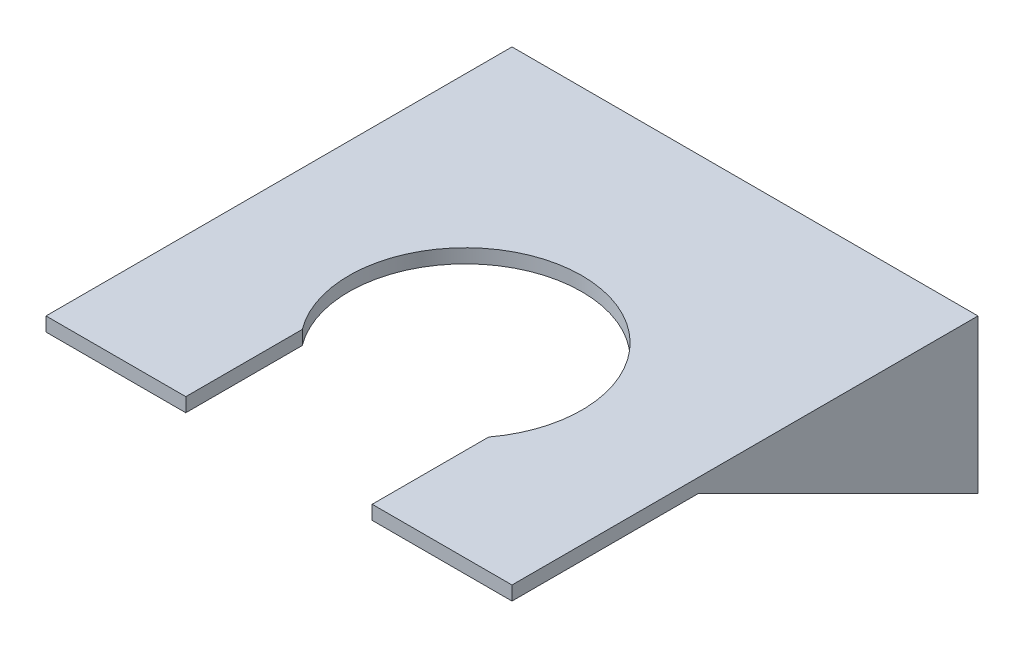
ISO-10303-21;
HEADER;
FILE_DESCRIPTION(('STEP AP214'),'2;1');
FILE_NAME('part.step','',(''),(''),'','','');
FILE_SCHEMA(('AUTOMOTIVE_DESIGN { 1 0 10303 214 1 1 1 1 }'));
ENDSEC;
DATA;
#1=APPLICATION_CONTEXT('core data for automotive mechanical design processes');
#2=APPLICATION_PROTOCOL_DEFINITION('international standard','automotive_design',2000,#1);
#3=PRODUCT_CONTEXT('',#1,'mechanical');
#4=PRODUCT('Part','Part','',(#3));
#5=PRODUCT_RELATED_PRODUCT_CATEGORY('part','',(#4));
#6=PRODUCT_DEFINITION_FORMATION('','',#4);
#7=PRODUCT_DEFINITION_CONTEXT('part definition',#1,'design');
#8=PRODUCT_DEFINITION('design','',#6,#7);
#9=PRODUCT_DEFINITION_SHAPE('','',#8);
#10=(LENGTH_UNIT() NAMED_UNIT(*) SI_UNIT(.MILLI.,.METRE.));
#11=(NAMED_UNIT(*) PLANE_ANGLE_UNIT() SI_UNIT($,.RADIAN.));
#12=(NAMED_UNIT(*) SI_UNIT($,.STERADIAN.) SOLID_ANGLE_UNIT());
#13=UNCERTAINTY_MEASURE_WITH_UNIT(LENGTH_MEASURE(1.E-05),#10,'distance_accuracy_value','');
#14=(GEOMETRIC_REPRESENTATION_CONTEXT(3) GLOBAL_UNCERTAINTY_ASSIGNED_CONTEXT((#13)) GLOBAL_UNIT_ASSIGNED_CONTEXT((#10,
#11,#12)) REPRESENTATION_CONTEXT('',''));
#15=CARTESIAN_POINT('',(0.,0.,0.));
#16=DIRECTION('',(0.,0.,1.));
#17=DIRECTION('',(1.,0.,0.));
#18=AXIS2_PLACEMENT_3D('',#15,#16,#17);
#19=CARTESIAN_POINT('',(-25.,-2.56176848089127,50.));
#20=DIRECTION('',(0.,1.,0.));
#21=DIRECTION('',(-1.,0.,0.));
#22=AXIS2_PLACEMENT_3D('',#19,#20,#21);
#23=PLANE('',#22);
#24=DIRECTION('',(1.,0.,0.));
#25=VECTOR('',#24,1.);
#26=CARTESIAN_POINT('',(23.5,-2.56176848089129,30.));
#27=LINE('',#26,#25);
#28=CARTESIAN_POINT('',(23.5,-2.56176848089126,30.));
#29=VERTEX_POINT('',#28);
#30=CARTESIAN_POINT('',(25.,-2.56176848089126,30.));
#31=VERTEX_POINT('',#30);
#32=EDGE_CURVE('E53',#29,#31,#27,.T.);
#33=ORIENTED_EDGE('',*,*,#32,.T.);
#34=DIRECTION('',(0.,0.,-1.));
#35=VECTOR('',#34,1.);
#36=CARTESIAN_POINT('',(25.,-2.56176848089126,50.));
#37=LINE('',#36,#35);
#38=CARTESIAN_POINT('',(25.,-2.56176848089126,50.));
#39=VERTEX_POINT('',#38);
#40=EDGE_CURVE('E41',#39,#31,#37,.T.);
#41=ORIENTED_EDGE('',*,*,#40,.F.);
#42=DIRECTION('',(1.,0.,0.));
#43=VECTOR('',#42,1.);
#44=CARTESIAN_POINT('',(-25.,-2.56176848089127,50.));
#45=LINE('',#44,#43);
#46=CARTESIAN_POINT('',(10.,-2.56176848089127,50.));
#47=VERTEX_POINT('',#46);
#48=EDGE_CURVE('E190',#47,#39,#45,.T.);
#49=ORIENTED_EDGE('',*,*,#48,.F.);
#50=DIRECTION('',(0.,0.,1.));
#51=VECTOR('',#50,1.);
#52=CARTESIAN_POINT('',(10.,-2.56176848089126,37.5));
#53=LINE('',#52,#51);
#54=CARTESIAN_POINT('',(10.,-2.56176848089126,37.5));
#55=VERTEX_POINT('',#54);
#56=EDGE_CURVE('E164',#55,#47,#53,.T.);
#57=ORIENTED_EDGE('',*,*,#56,.F.);
#58=CARTESIAN_POINT('',(0.,-2.56176848089126,30.));
#59=DIRECTION('',(0.,1.,0.));
#60=DIRECTION('',(-1.,0.,0.));
#61=AXIS2_PLACEMENT_3D('',#58,#59,#60);
#62=CIRCLE('',#61,12.5);
#63=CARTESIAN_POINT('',(-10.,-2.56176848089127,37.5));
#64=VERTEX_POINT('',#63);
#65=EDGE_CURVE('E166',#64,#55,#62,.F.);
#66=ORIENTED_EDGE('',*,*,#65,.F.);
#67=DIRECTION('',(0.,0.,-1.));
#68=VECTOR('',#67,1.);
#69=CARTESIAN_POINT('',(-10.,-2.56176848089127,37.5));
#70=LINE('',#69,#68);
#71=CARTESIAN_POINT('',(-10.,-2.56176848089127,50.));
#72=VERTEX_POINT('',#71);
#73=EDGE_CURVE('E169',#72,#64,#70,.T.);
#74=ORIENTED_EDGE('',*,*,#73,.F.);
#75=CARTESIAN_POINT('',(-25.,-2.56176848089127,50.));
#76=VERTEX_POINT('',#75);
#77=EDGE_CURVE('E192',#76,#72,#45,.T.);
#78=ORIENTED_EDGE('',*,*,#77,.F.);
#79=DIRECTION('',(0.,0.,-1.));
#80=VECTOR('',#79,1.);
#81=CARTESIAN_POINT('',(-25.,-2.56176848089127,50.));
#82=LINE('',#81,#80);
#83=CARTESIAN_POINT('',(-25.,-2.56176848089129,30.));
#84=VERTEX_POINT('',#83);
#85=EDGE_CURVE('E11',#76,#84,#82,.T.);
#86=ORIENTED_EDGE('',*,*,#85,.T.);
#87=DIRECTION('',(-1.,0.,0.));
#88=VECTOR('',#87,1.);
#89=CARTESIAN_POINT('',(-23.5,-2.56176848089129,30.));
#90=LINE('',#89,#88);
#91=CARTESIAN_POINT('',(-23.5,-2.56176848089129,30.));
#92=VERTEX_POINT('',#91);
#93=EDGE_CURVE('E159',#92,#84,#90,.T.);
#94=ORIENTED_EDGE('',*,*,#93,.F.);
#95=DIRECTION('',(0.,0.,-1.));
#96=VECTOR('',#95,1.);
#97=CARTESIAN_POINT('',(-23.5,-2.56176848089129,30.));
#98=LINE('',#97,#96);
#99=CARTESIAN_POINT('',(-23.5,-2.56176848089127,0.));
#100=VERTEX_POINT('',#99);
#101=EDGE_CURVE('E147',#92,#100,#98,.T.);
#102=ORIENTED_EDGE('',*,*,#101,.T.);
#103=DIRECTION('',(1.,0.,0.));
#104=VECTOR('',#103,1.);
#105=CARTESIAN_POINT('',(-25.,-2.56176848089127,0.));
#106=LINE('',#105,#104);
#107=CARTESIAN_POINT('',(23.5,-2.56176848089126,0.));
#108=VERTEX_POINT('',#107);
#109=EDGE_CURVE('E203',#100,#108,#106,.T.);
#110=ORIENTED_EDGE('',*,*,#109,.T.);
#111=DIRECTION('',(0.,0.,-1.));
#112=VECTOR('',#111,1.);
#113=CARTESIAN_POINT('',(23.5,-2.56176848089129,30.));
#114=LINE('',#113,#112);
#115=EDGE_CURVE('E48',#29,#108,#114,.T.);
#116=ORIENTED_EDGE('',*,*,#115,.F.);
#117=EDGE_LOOP('',(#33,#41,#49,#57,#66,#74,#78,#86,#94,#102,#110,#116));
#118=FACE_BOUND('',#117,.T.);
#119=ADVANCED_FACE('F33',(#118),#23,.F.);
#120=CARTESIAN_POINT('',(0.,0.,50.));
#121=DIRECTION('',(0.,0.,1.));
#122=DIRECTION('',(1.,0.,0.));
#123=AXIS2_PLACEMENT_3D('',#120,#121,#122);
#124=PLANE('',#123);
#125=DIRECTION('',(0.,1.,0.));
#126=VECTOR('',#125,1.);
#127=CARTESIAN_POINT('',(10.,-43.5648171480331,50.));
#128=LINE('',#127,#126);
#129=CARTESIAN_POINT('',(10.,-1.06176848089127,50.));
#130=VERTEX_POINT('',#129);
#131=EDGE_CURVE('E179',#47,#130,#128,.T.);
#132=ORIENTED_EDGE('',*,*,#131,.F.);
#133=ORIENTED_EDGE('',*,*,#48,.T.);
#134=DIRECTION('',(0.,1.,0.));
#135=VECTOR('',#134,1.);
#136=CARTESIAN_POINT('',(25.,-1.06176848089126,50.));
#137=LINE('',#136,#135);
#138=CARTESIAN_POINT('',(25.,-1.06176848089126,50.));
#139=VERTEX_POINT('',#138);
#140=EDGE_CURVE('E195',#39,#139,#137,.T.);
#141=ORIENTED_EDGE('',*,*,#140,.T.);
#142=DIRECTION('',(-1.,0.,0.));
#143=VECTOR('',#142,1.);
#144=CARTESIAN_POINT('',(-25.,-1.06176848089127,50.));
#145=LINE('',#144,#143);
#146=EDGE_CURVE('E198',#139,#130,#145,.T.);
#147=ORIENTED_EDGE('',*,*,#146,.T.);
#148=EDGE_LOOP('',(#132,#133,#141,#147));
#149=FACE_BOUND('',#148,.T.);
#150=ADVANCED_FACE('F220',(#149),#124,.T.);
#151=CARTESIAN_POINT('',(-25.,-1.06176848089127,50.));
#152=DIRECTION('',(1.,0.,0.));
#153=DIRECTION('',(0.,0.,-1.));
#154=AXIS2_PLACEMENT_3D('',#151,#152,#153);
#155=PLANE('',#154);
#156=DIRECTION('',(0.,-1.,0.));
#157=VECTOR('',#156,1.);
#158=CARTESIAN_POINT('',(-25.,-1.06176848089127,0.));
#159=LINE('',#158,#157);
#160=CARTESIAN_POINT('',(-25.,-1.06176848089127,0.));
#161=VERTEX_POINT('',#160);
#162=CARTESIAN_POINT('',(-25.,-17.5617684808913,0.));
#163=VERTEX_POINT('',#162);
#164=EDGE_CURVE('E186',#161,#163,#159,.T.);
#165=ORIENTED_EDGE('',*,*,#164,.T.);
#166=DIRECTION('',(0.,0.447213595499958,0.894427190999916));
#167=VECTOR('',#166,1.);
#168=CARTESIAN_POINT('',(-25.,-17.5617684808913,0.));
#169=LINE('',#168,#167);
#170=EDGE_CURVE('E138',#163,#84,#169,.T.);
#171=ORIENTED_EDGE('',*,*,#170,.T.);
#172=ORIENTED_EDGE('',*,*,#85,.F.);
#173=DIRECTION('',(0.,-1.,0.));
#174=VECTOR('',#173,1.);
#175=CARTESIAN_POINT('',(-25.,-1.06176848089127,50.));
#176=LINE('',#175,#174);
#177=CARTESIAN_POINT('',(-25.,-1.06176848089127,50.));
#178=VERTEX_POINT('',#177);
#179=EDGE_CURVE('E187',#178,#76,#176,.T.);
#180=ORIENTED_EDGE('',*,*,#179,.F.);
#181=DIRECTION('',(0.,0.,-1.));
#182=VECTOR('',#181,1.);
#183=CARTESIAN_POINT('',(-25.,-1.06176848089127,50.));
#184=LINE('',#183,#182);
#185=EDGE_CURVE('E201',#178,#161,#184,.T.);
#186=ORIENTED_EDGE('',*,*,#185,.T.);
#187=EDGE_LOOP('',(#165,#171,#172,#180,#186));
#188=FACE_BOUND('',#187,.T.);
#189=ADVANCED_FACE('F35',(#188),#155,.F.);
#190=CARTESIAN_POINT('',(25.,-1.06176848089126,50.));
#191=DIRECTION('',(-1.,0.,0.));
#192=DIRECTION('',(0.,0.,1.));
#193=AXIS2_PLACEMENT_3D('',#190,#191,#192);
#194=PLANE('',#193);
#195=DIRECTION('',(0.,1.,0.));
#196=VECTOR('',#195,1.);
#197=CARTESIAN_POINT('',(25.,-1.06176848089126,0.));
#198=LINE('',#197,#196);
#199=CARTESIAN_POINT('',(25.,-17.5617684808913,0.));
#200=VERTEX_POINT('',#199);
#201=CARTESIAN_POINT('',(25.,-1.06176848089126,0.));
#202=VERTEX_POINT('',#201);
#203=EDGE_CURVE('E134',#200,#202,#198,.T.);
#204=ORIENTED_EDGE('',*,*,#203,.T.);
#205=DIRECTION('',(0.,0.,-1.));
#206=VECTOR('',#205,1.);
#207=CARTESIAN_POINT('',(25.,-1.06176848089126,50.));
#208=LINE('',#207,#206);
#209=EDGE_CURVE('E209',#139,#202,#208,.T.);
#210=ORIENTED_EDGE('',*,*,#209,.F.);
#211=ORIENTED_EDGE('',*,*,#140,.F.);
#212=ORIENTED_EDGE('',*,*,#40,.T.);
#213=DIRECTION('',(0.,0.447213595499958,0.894427190999916));
#214=VECTOR('',#213,1.);
#215=CARTESIAN_POINT('',(25.,-17.5617684808913,0.));
#216=LINE('',#215,#214);
#217=EDGE_CURVE('E142',#200,#31,#216,.T.);
#218=ORIENTED_EDGE('',*,*,#217,.F.);
#219=EDGE_LOOP('',(#204,#210,#211,#212,#218));
#220=FACE_BOUND('',#219,.T.);
#221=ADVANCED_FACE('F213',(#220),#194,.F.);
#222=CARTESIAN_POINT('',(-25.,-1.06176848089127,50.));
#223=DIRECTION('',(0.,-1.,0.));
#224=DIRECTION('',(1.,0.,0.));
#225=AXIS2_PLACEMENT_3D('',#222,#223,#224);
#226=PLANE('',#225);
#227=CARTESIAN_POINT('',(0.,-1.06176848089127,30.));
#228=DIRECTION('',(0.,1.,0.));
#229=DIRECTION('',(0.,0.,1.));
#230=AXIS2_PLACEMENT_3D('',#227,#228,#229);
#231=CIRCLE('',#230,12.5);
#232=CARTESIAN_POINT('',(10.,-1.06176848089127,37.5));
#233=VERTEX_POINT('',#232);
#234=CARTESIAN_POINT('',(-10.,-1.06176848089127,37.5));
#235=VERTEX_POINT('',#234);
#236=EDGE_CURVE('E161',#233,#235,#231,.T.);
#237=ORIENTED_EDGE('',*,*,#236,.F.);
#238=DIRECTION('',(0.,0.,-1.));
#239=VECTOR('',#238,1.);
#240=CARTESIAN_POINT('',(10.,-1.06176848089127,37.5));
#241=LINE('',#240,#239);
#242=EDGE_CURVE('E174',#130,#233,#241,.T.);
#243=ORIENTED_EDGE('',*,*,#242,.F.);
#244=ORIENTED_EDGE('',*,*,#146,.F.);
#245=ORIENTED_EDGE('',*,*,#209,.T.);
#246=DIRECTION('',(-1.,0.,0.));
#247=VECTOR('',#246,1.);
#248=CARTESIAN_POINT('',(-25.,-1.06176848089127,0.));
#249=LINE('',#248,#247);
#250=EDGE_CURVE('E191',#202,#161,#249,.T.);
#251=ORIENTED_EDGE('',*,*,#250,.T.);
#252=ORIENTED_EDGE('',*,*,#185,.F.);
#253=CARTESIAN_POINT('',(-10.,-1.06176848089127,50.));
#254=VERTEX_POINT('',#253);
#255=EDGE_CURVE('E197',#254,#178,#145,.T.);
#256=ORIENTED_EDGE('',*,*,#255,.F.);
#257=DIRECTION('',(0.,0.,1.));
#258=VECTOR('',#257,1.);
#259=CARTESIAN_POINT('',(-10.,-1.06176848089127,37.5));
#260=LINE('',#259,#258);
#261=EDGE_CURVE('E172',#235,#254,#260,.T.);
#262=ORIENTED_EDGE('',*,*,#261,.F.);
#263=EDGE_LOOP('',(#237,#243,#244,#245,#251,#252,#256,#262));
#264=FACE_BOUND('',#263,.T.);
#265=ADVANCED_FACE('F228',(#264),#226,.F.);
#266=DIRECTION('',(0.,1.,0.));
#267=VECTOR('',#266,1.);
#268=CARTESIAN_POINT('',(-10.,-43.5648171480331,50.));
#269=LINE('',#268,#267);
#270=EDGE_CURVE('E181',#72,#254,#269,.T.);
#271=ORIENTED_EDGE('',*,*,#270,.T.);
#272=ORIENTED_EDGE('',*,*,#255,.T.);
#273=ORIENTED_EDGE('',*,*,#179,.T.);
#274=ORIENTED_EDGE('',*,*,#77,.T.);
#275=EDGE_LOOP('',(#271,#272,#273,#274));
#276=FACE_BOUND('',#275,.T.);
#277=ADVANCED_FACE('F237',(#276),#124,.T.);
#278=CARTESIAN_POINT('',(0.,0.,0.));
#279=DIRECTION('',(0.,0.,1.));
#280=DIRECTION('',(1.,0.,0.));
#281=AXIS2_PLACEMENT_3D('',#278,#279,#280);
#282=PLANE('',#281);
#283=ORIENTED_EDGE('',*,*,#164,.F.);
#284=ORIENTED_EDGE('',*,*,#250,.F.);
#285=ORIENTED_EDGE('',*,*,#203,.F.);
#286=DIRECTION('',(1.,0.,0.));
#287=VECTOR('',#286,1.);
#288=CARTESIAN_POINT('',(23.5,-17.5617684808913,0.));
#289=LINE('',#288,#287);
#290=CARTESIAN_POINT('',(23.5,-17.5617684808913,0.));
#291=VERTEX_POINT('',#290);
#292=EDGE_CURVE('E130',#291,#200,#289,.T.);
#293=ORIENTED_EDGE('',*,*,#292,.F.);
#294=DIRECTION('',(0.,-1.,0.));
#295=VECTOR('',#294,1.);
#296=CARTESIAN_POINT('',(23.5,-2.56176848089129,0.));
#297=LINE('',#296,#295);
#298=EDGE_CURVE('E121',#108,#291,#297,.T.);
#299=ORIENTED_EDGE('',*,*,#298,.F.);
#300=ORIENTED_EDGE('',*,*,#109,.F.);
#301=DIRECTION('',(0.,-1.,0.));
#302=VECTOR('',#301,1.);
#303=CARTESIAN_POINT('',(-23.5,-2.56176848089129,0.));
#304=LINE('',#303,#302);
#305=CARTESIAN_POINT('',(-23.5,-17.5617684808913,0.));
#306=VERTEX_POINT('',#305);
#307=EDGE_CURVE('E150',#100,#306,#304,.T.);
#308=ORIENTED_EDGE('',*,*,#307,.T.);
#309=DIRECTION('',(-1.,0.,0.));
#310=VECTOR('',#309,1.);
#311=CARTESIAN_POINT('',(-23.5,-17.5617684808913,0.));
#312=LINE('',#311,#310);
#313=EDGE_CURVE('E156',#306,#163,#312,.T.);
#314=ORIENTED_EDGE('',*,*,#313,.T.);
#315=EDGE_LOOP('',(#283,#284,#285,#293,#299,#300,#308,#314));
#316=FACE_BOUND('',#315,.T.);
#317=ADVANCED_FACE('F132',(#316),#282,.F.);
#318=CARTESIAN_POINT('',(0.,-43.5648171480331,30.));
#319=DIRECTION('',(0.,1.,0.));
#320=DIRECTION('',(0.,0.,1.));
#321=AXIS2_PLACEMENT_3D('',#318,#319,#320);
#322=CYLINDRICAL_SURFACE('',#321,12.5);
#323=ORIENTED_EDGE('',*,*,#65,.T.);
#324=DIRECTION('',(0.,1.,0.));
#325=VECTOR('',#324,1.);
#326=CARTESIAN_POINT('',(10.,-43.5648171480331,37.5));
#327=LINE('',#326,#325);
#328=EDGE_CURVE('E167',#55,#233,#327,.T.);
#329=ORIENTED_EDGE('',*,*,#328,.T.);
#330=ORIENTED_EDGE('',*,*,#236,.T.);
#331=DIRECTION('',(0.,1.,0.));
#332=VECTOR('',#331,1.);
#333=CARTESIAN_POINT('',(-10.,-43.5648171480331,37.5));
#334=LINE('',#333,#332);
#335=EDGE_CURVE('E177',#64,#235,#334,.T.);
#336=ORIENTED_EDGE('',*,*,#335,.F.);
#337=EDGE_LOOP('',(#323,#329,#330,#336));
#338=FACE_BOUND('',#337,.T.);
#339=ADVANCED_FACE('F233',(#338),#322,.F.);
#340=CARTESIAN_POINT('',(10.,-43.5648171480331,37.5));
#341=DIRECTION('',(1.,0.,0.));
#342=DIRECTION('',(0.,0.,-1.));
#343=AXIS2_PLACEMENT_3D('',#340,#341,#342);
#344=PLANE('',#343);
#345=ORIENTED_EDGE('',*,*,#56,.T.);
#346=ORIENTED_EDGE('',*,*,#131,.T.);
#347=ORIENTED_EDGE('',*,*,#242,.T.);
#348=ORIENTED_EDGE('',*,*,#328,.F.);
#349=EDGE_LOOP('',(#345,#346,#347,#348));
#350=FACE_BOUND('',#349,.T.);
#351=ADVANCED_FACE('F224',(#350),#344,.F.);
#352=CARTESIAN_POINT('',(-10.,-43.5648171480331,37.5));
#353=DIRECTION('',(-1.,0.,0.));
#354=DIRECTION('',(0.,0.,1.));
#355=AXIS2_PLACEMENT_3D('',#352,#353,#354);
#356=PLANE('',#355);
#357=ORIENTED_EDGE('',*,*,#73,.T.);
#358=ORIENTED_EDGE('',*,*,#335,.T.);
#359=ORIENTED_EDGE('',*,*,#261,.T.);
#360=ORIENTED_EDGE('',*,*,#270,.F.);
#361=EDGE_LOOP('',(#357,#358,#359,#360));
#362=FACE_BOUND('',#361,.T.);
#363=ADVANCED_FACE('F256',(#362),#356,.F.);
#364=CARTESIAN_POINT('',(-23.5,-17.5617684808913,0.));
#365=DIRECTION('',(0.,-0.894427190999916,0.447213595499958));
#366=DIRECTION('',(0.,-0.447213595499958,-0.894427190999916));
#367=AXIS2_PLACEMENT_3D('',#364,#365,#366);
#368=PLANE('',#367);
#369=ORIENTED_EDGE('',*,*,#170,.F.);
#370=ORIENTED_EDGE('',*,*,#313,.F.);
#371=DIRECTION('',(0.,0.447213595499958,0.894427190999916));
#372=VECTOR('',#371,1.);
#373=CARTESIAN_POINT('',(-23.5,-17.5617684808913,0.));
#374=LINE('',#373,#372);
#375=EDGE_CURVE('E153',#306,#92,#374,.T.);
#376=ORIENTED_EDGE('',*,*,#375,.T.);
#377=ORIENTED_EDGE('',*,*,#93,.T.);
#378=EDGE_LOOP('',(#369,#370,#376,#377));
#379=FACE_BOUND('',#378,.T.);
#380=ADVANCED_FACE('F245',(#379),#368,.T.);
#381=CARTESIAN_POINT('',(-23.5,0.,0.));
#382=DIRECTION('',(-1.,0.,0.));
#383=DIRECTION('',(0.,0.,1.));
#384=AXIS2_PLACEMENT_3D('',#381,#382,#383);
#385=PLANE('',#384);
#386=ORIENTED_EDGE('',*,*,#101,.F.);
#387=ORIENTED_EDGE('',*,*,#375,.F.);
#388=ORIENTED_EDGE('',*,*,#307,.F.);
#389=EDGE_LOOP('',(#386,#387,#388));
#390=FACE_BOUND('',#389,.T.);
#391=ADVANCED_FACE('F248',(#390),#385,.F.);
#392=CARTESIAN_POINT('',(23.5,-17.5617684808913,0.));
#393=DIRECTION('',(0.,0.894427190999916,-0.447213595499958));
#394=DIRECTION('',(0.,0.447213595499958,0.894427190999916));
#395=AXIS2_PLACEMENT_3D('',#392,#393,#394);
#396=PLANE('',#395);
#397=ORIENTED_EDGE('',*,*,#217,.T.);
#398=ORIENTED_EDGE('',*,*,#32,.F.);
#399=DIRECTION('',(0.,0.447213595499958,0.894427190999916));
#400=VECTOR('',#399,1.);
#401=CARTESIAN_POINT('',(23.5,-17.5617684808913,0.));
#402=LINE('',#401,#400);
#403=EDGE_CURVE('E125',#291,#29,#402,.T.);
#404=ORIENTED_EDGE('',*,*,#403,.F.);
#405=ORIENTED_EDGE('',*,*,#292,.T.);
#406=EDGE_LOOP('',(#397,#398,#404,#405));
#407=FACE_BOUND('',#406,.T.);
#408=ADVANCED_FACE('F140',(#407),#396,.F.);
#409=CARTESIAN_POINT('',(23.5,0.,0.));
#410=DIRECTION('',(1.,0.,0.));
#411=DIRECTION('',(0.,0.,1.));
#412=AXIS2_PLACEMENT_3D('',#409,#410,#411);
#413=PLANE('',#412);
#414=ORIENTED_EDGE('',*,*,#115,.T.);
#415=ORIENTED_EDGE('',*,*,#298,.T.);
#416=ORIENTED_EDGE('',*,*,#403,.T.);
#417=EDGE_LOOP('',(#414,#415,#416));
#418=FACE_BOUND('',#417,.T.);
#419=ADVANCED_FACE('F123',(#418),#413,.F.);
#420=CLOSED_SHELL('',(#119,#150,#189,#221,#265,#277,#317,#339,#351,#363,#380,#391,#408,#419));
#421=MANIFOLD_SOLID_BREP('B2',#420);
#422=ADVANCED_BREP_SHAPE_REPRESENTATION('',(#18,#421),#14);
#423=SHAPE_DEFINITION_REPRESENTATION(#9,#422);
ENDSEC;
END-ISO-10303-21;
